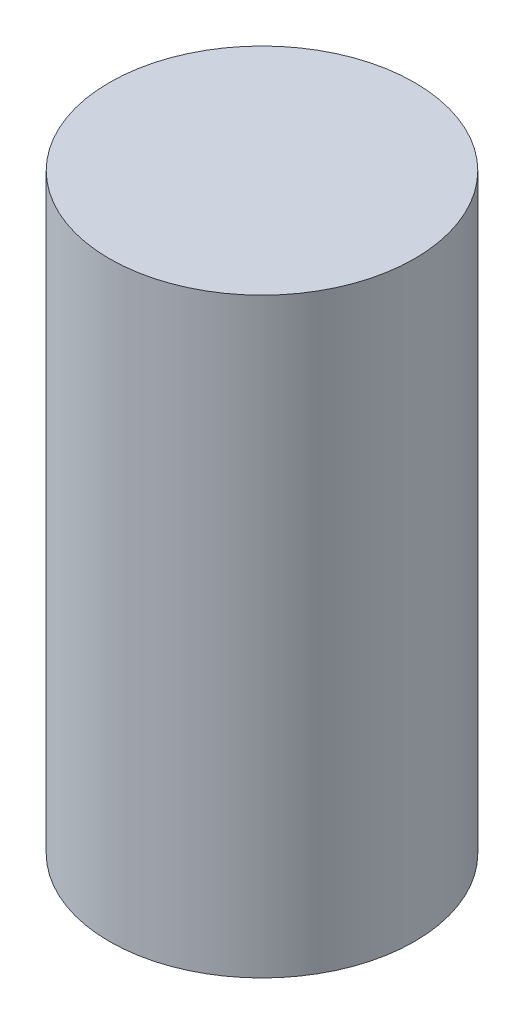
ISO-10303-21;
HEADER;
FILE_DESCRIPTION(('STEP AP214'),'2;1');
FILE_NAME('part.step','',(''),(''),'','','');
FILE_SCHEMA(('AUTOMOTIVE_DESIGN { 1 0 10303 214 1 1 1 1 }'));
ENDSEC;
DATA;
#1=APPLICATION_CONTEXT('core data for automotive mechanical design processes');
#2=APPLICATION_PROTOCOL_DEFINITION('international standard','automotive_design',2000,#1);
#3=PRODUCT_CONTEXT('',#1,'mechanical');
#4=PRODUCT('Part','Part','',(#3));
#5=PRODUCT_RELATED_PRODUCT_CATEGORY('part','',(#4));
#6=PRODUCT_DEFINITION_FORMATION('','',#4);
#7=PRODUCT_DEFINITION_CONTEXT('part definition',#1,'design');
#8=PRODUCT_DEFINITION('design','',#6,#7);
#9=PRODUCT_DEFINITION_SHAPE('','',#8);
#10=(LENGTH_UNIT() NAMED_UNIT(*) SI_UNIT(.MILLI.,.METRE.));
#11=(NAMED_UNIT(*) PLANE_ANGLE_UNIT() SI_UNIT($,.RADIAN.));
#12=(NAMED_UNIT(*) SI_UNIT($,.STERADIAN.) SOLID_ANGLE_UNIT());
#13=UNCERTAINTY_MEASURE_WITH_UNIT(LENGTH_MEASURE(1.E-05),#10,'distance_accuracy_value','');
#14=(GEOMETRIC_REPRESENTATION_CONTEXT(3) GLOBAL_UNCERTAINTY_ASSIGNED_CONTEXT((#13)) GLOBAL_UNIT_ASSIGNED_CONTEXT((#10,
#11,#12)) REPRESENTATION_CONTEXT('',''));
#15=CARTESIAN_POINT('',(0.,0.,0.));
#16=DIRECTION('',(0.,0.,1.));
#17=DIRECTION('',(1.,0.,0.));
#18=AXIS2_PLACEMENT_3D('',#15,#16,#17);
#19=CARTESIAN_POINT('',(0.,31.,0.));
#20=DIRECTION('',(0.,-1.,0.));
#21=DIRECTION('',(0.,0.,-1.));
#22=AXIS2_PLACEMENT_3D('',#19,#20,#21);
#23=CYLINDRICAL_SURFACE('',#22,8.);
#24=CARTESIAN_POINT('',(0.,31.,0.));
#25=DIRECTION('',(0.,1.,0.));
#26=DIRECTION('',(0.,0.,1.));
#27=AXIS2_PLACEMENT_3D('',#24,#25,#26);
#28=CIRCLE('',#27,8.);
#29=CARTESIAN_POINT('',(0.,31.,8.));
#30=VERTEX_POINT('',#29);
#31=EDGE_CURVE('E10',#30,#30,#28,.T.);
#32=ORIENTED_EDGE('',*,*,#31,.F.);
#33=EDGE_LOOP('',(#32));
#34=FACE_BOUND('',#33,.T.);
#35=CARTESIAN_POINT('',(0.,0.,0.));
#36=DIRECTION('',(0.,1.,0.));
#37=DIRECTION('',(0.,0.,1.));
#38=AXIS2_PLACEMENT_3D('',#35,#36,#37);
#39=CIRCLE('',#38,8.);
#40=CARTESIAN_POINT('',(0.,0.,8.));
#41=VERTEX_POINT('',#40);
#42=EDGE_CURVE('E34',#41,#41,#39,.T.);
#43=ORIENTED_EDGE('',*,*,#42,.T.);
#44=EDGE_LOOP('',(#43));
#45=FACE_BOUND('',#44,.T.);
#46=ADVANCED_FACE('F31',(#34,#45),#23,.T.);
#47=CARTESIAN_POINT('',(0.,31.,0.));
#48=DIRECTION('',(0.,1.,0.));
#49=DIRECTION('',(0.,0.,1.));
#50=AXIS2_PLACEMENT_3D('',#47,#48,#49);
#51=PLANE('',#50);
#52=ORIENTED_EDGE('',*,*,#31,.T.);
#53=EDGE_LOOP('',(#52));
#54=FACE_BOUND('',#53,.T.);
#55=ADVANCED_FACE('F46',(#54),#51,.T.);
#56=CARTESIAN_POINT('',(0.,0.,0.));
#57=DIRECTION('',(0.,1.,0.));
#58=DIRECTION('',(0.,0.,1.));
#59=AXIS2_PLACEMENT_3D('',#56,#57,#58);
#60=PLANE('',#59);
#61=ORIENTED_EDGE('',*,*,#42,.F.);
#62=EDGE_LOOP('',(#61));
#63=FACE_BOUND('',#62,.T.);
#64=ADVANCED_FACE('F44',(#63),#60,.F.);
#65=CLOSED_SHELL('',(#46,#55,#64));
#66=MANIFOLD_SOLID_BREP('B2',#65);
#67=ADVANCED_BREP_SHAPE_REPRESENTATION('',(#18,#66),#14);
#68=SHAPE_DEFINITION_REPRESENTATION(#9,#67);
ENDSEC;
END-ISO-10303-21;
